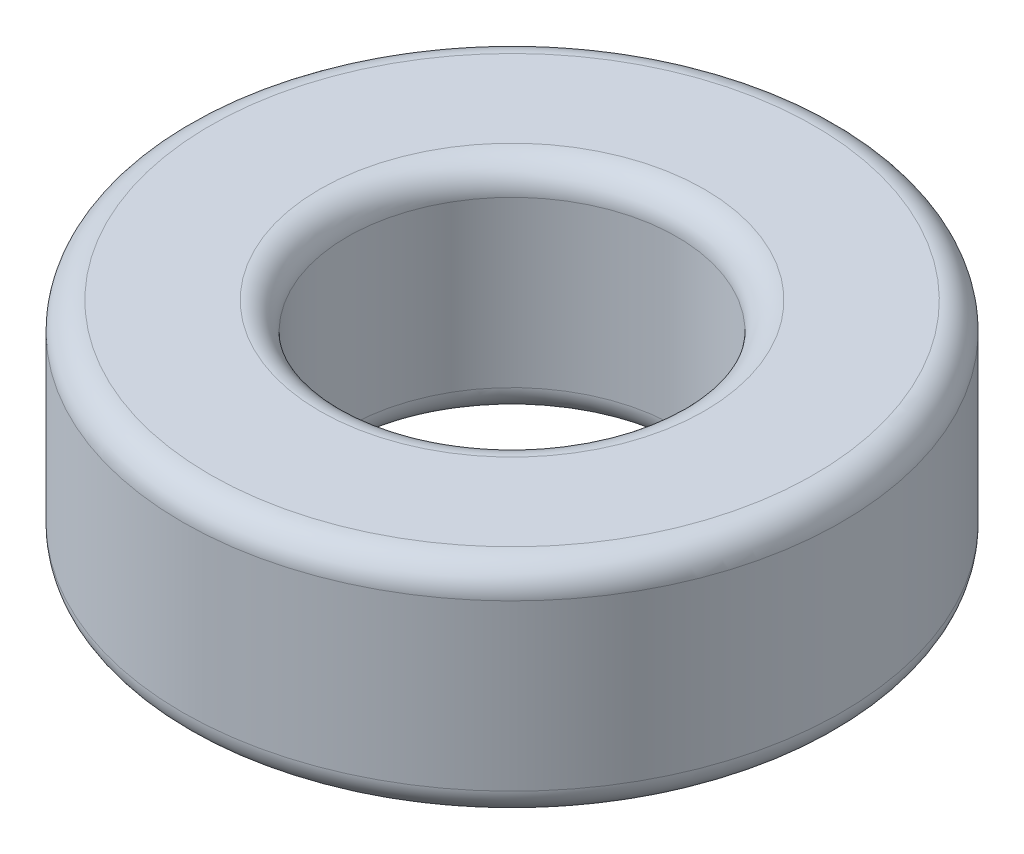
ISO-10303-21;
HEADER;
FILE_DESCRIPTION(('STEP AP214'),'2;1');
FILE_NAME('part.step','',(''),(''),'','','');
FILE_SCHEMA(('AUTOMOTIVE_DESIGN { 1 0 10303 214 1 1 1 1 }'));
ENDSEC;
DATA;
#1=APPLICATION_CONTEXT('core data for automotive mechanical design processes');
#2=APPLICATION_PROTOCOL_DEFINITION('international standard','automotive_design',2000,#1);
#3=PRODUCT_CONTEXT('',#1,'mechanical');
#4=PRODUCT('Part','Part','',(#3));
#5=PRODUCT_RELATED_PRODUCT_CATEGORY('part','',(#4));
#6=PRODUCT_DEFINITION_FORMATION('','',#4);
#7=PRODUCT_DEFINITION_CONTEXT('part definition',#1,'design');
#8=PRODUCT_DEFINITION('design','',#6,#7);
#9=PRODUCT_DEFINITION_SHAPE('','',#8);
#10=(LENGTH_UNIT() NAMED_UNIT(*) SI_UNIT(.MILLI.,.METRE.));
#11=(NAMED_UNIT(*) PLANE_ANGLE_UNIT() SI_UNIT($,.RADIAN.));
#12=(NAMED_UNIT(*) SI_UNIT($,.STERADIAN.) SOLID_ANGLE_UNIT());
#13=UNCERTAINTY_MEASURE_WITH_UNIT(LENGTH_MEASURE(1.E-05),#10,'distance_accuracy_value','');
#14=(GEOMETRIC_REPRESENTATION_CONTEXT(3) GLOBAL_UNCERTAINTY_ASSIGNED_CONTEXT((#13)) GLOBAL_UNIT_ASSIGNED_CONTEXT((#10,
#11,#12)) REPRESENTATION_CONTEXT('',''));
#15=CARTESIAN_POINT('',(0.,0.,0.));
#16=DIRECTION('',(0.,0.,1.));
#17=DIRECTION('',(1.,0.,0.));
#18=AXIS2_PLACEMENT_3D('',#15,#16,#17);
#19=CARTESIAN_POINT('',(0.,4.,0.));
#20=DIRECTION('',(0.,1.,0.));
#21=DIRECTION('',(0.,0.,1.));
#22=AXIS2_PLACEMENT_3D('',#19,#20,#21);
#23=PLANE('',#22);
#24=CARTESIAN_POINT('',(0.,4.,0.));
#25=DIRECTION('',(0.,1.,0.));
#26=DIRECTION('',(0.,0.,1.));
#27=AXIS2_PLACEMENT_3D('',#24,#25,#26);
#28=CIRCLE('',#27,5.5);
#29=CARTESIAN_POINT('',(0.,4.,5.5));
#30=VERTEX_POINT('',#29);
#31=EDGE_CURVE('E10',#30,#30,#28,.T.);
#32=ORIENTED_EDGE('',*,*,#31,.T.);
#33=EDGE_LOOP('',(#32));
#34=FACE_BOUND('',#33,.T.);
#35=CARTESIAN_POINT('',(0.,4.,0.));
#36=DIRECTION('',(0.,1.,0.));
#37=DIRECTION('',(0.,0.,1.));
#38=AXIS2_PLACEMENT_3D('',#35,#36,#37);
#39=CIRCLE('',#38,3.5);
#40=CARTESIAN_POINT('',(0.,4.,3.5));
#41=VERTEX_POINT('',#40);
#42=EDGE_CURVE('E41',#41,#41,#39,.F.);
#43=ORIENTED_EDGE('',*,*,#42,.T.);
#44=EDGE_LOOP('',(#43));
#45=FACE_BOUND('',#44,.T.);
#46=ADVANCED_FACE('F34',(#34,#45),#23,.T.);
#47=CARTESIAN_POINT('',(0.,0.,0.));
#48=DIRECTION('',(0.,1.,0.));
#49=DIRECTION('',(0.,0.,1.));
#50=AXIS2_PLACEMENT_3D('',#47,#48,#49);
#51=PLANE('',#50);
#52=CARTESIAN_POINT('',(0.,0.,0.));
#53=DIRECTION('',(0.,1.,0.));
#54=DIRECTION('',(0.,0.,1.));
#55=AXIS2_PLACEMENT_3D('',#52,#53,#54);
#56=CIRCLE('',#55,3.5);
#57=CARTESIAN_POINT('',(0.,0.,3.5));
#58=VERTEX_POINT('',#57);
#59=EDGE_CURVE('E60',#58,#58,#56,.T.);
#60=ORIENTED_EDGE('',*,*,#59,.T.);
#61=EDGE_LOOP('',(#60));
#62=FACE_BOUND('',#61,.T.);
#63=CARTESIAN_POINT('',(0.,0.,0.));
#64=DIRECTION('',(0.,1.,0.));
#65=DIRECTION('',(0.,0.,1.));
#66=AXIS2_PLACEMENT_3D('',#63,#64,#65);
#67=CIRCLE('',#66,5.5);
#68=CARTESIAN_POINT('',(0.,0.,5.5));
#69=VERTEX_POINT('',#68);
#70=EDGE_CURVE('E63',#69,#69,#67,.F.);
#71=ORIENTED_EDGE('',*,*,#70,.T.);
#72=EDGE_LOOP('',(#71));
#73=FACE_BOUND('',#72,.T.);
#74=ADVANCED_FACE('F67',(#62,#73),#51,.F.);
#75=CARTESIAN_POINT('',(0.,4.,0.));
#76=DIRECTION('',(0.,-1.,0.));
#77=DIRECTION('',(0.,0.,-1.));
#78=AXIS2_PLACEMENT_3D('',#75,#76,#77);
#79=CYLINDRICAL_SURFACE('',#78,6.);
#80=CARTESIAN_POINT('',(0.,0.5,0.));
#81=DIRECTION('',(0.,1.,0.));
#82=DIRECTION('',(0.,0.,1.));
#83=AXIS2_PLACEMENT_3D('',#80,#81,#82);
#84=CIRCLE('',#83,6.);
#85=CARTESIAN_POINT('',(0.,0.5,6.));
#86=VERTEX_POINT('',#85);
#87=EDGE_CURVE('E45',#86,#86,#84,.T.);
#88=ORIENTED_EDGE('',*,*,#87,.T.);
#89=EDGE_LOOP('',(#88));
#90=FACE_BOUND('',#89,.T.);
#91=CARTESIAN_POINT('',(0.,3.5,0.));
#92=DIRECTION('',(0.,1.,0.));
#93=DIRECTION('',(0.,0.,1.));
#94=AXIS2_PLACEMENT_3D('',#91,#92,#93);
#95=CIRCLE('',#94,6.);
#96=CARTESIAN_POINT('',(0.,3.5,6.));
#97=VERTEX_POINT('',#96);
#98=EDGE_CURVE('E49',#97,#97,#95,.F.);
#99=ORIENTED_EDGE('',*,*,#98,.T.);
#100=EDGE_LOOP('',(#99));
#101=FACE_BOUND('',#100,.T.);
#102=ADVANCED_FACE('F77',(#90,#101),#79,.T.);
#103=CARTESIAN_POINT('',(0.,4.,0.));
#104=DIRECTION('',(0.,-1.,0.));
#105=DIRECTION('',(0.,0.,-1.));
#106=AXIS2_PLACEMENT_3D('',#103,#104,#105);
#107=CYLINDRICAL_SURFACE('',#106,3.);
#108=CARTESIAN_POINT('',(0.,0.5,0.));
#109=DIRECTION('',(0.,1.,0.));
#110=DIRECTION('',(0.,0.,1.));
#111=AXIS2_PLACEMENT_3D('',#108,#109,#110);
#112=CIRCLE('',#111,3.);
#113=CARTESIAN_POINT('',(0.,0.5,3.));
#114=VERTEX_POINT('',#113);
#115=EDGE_CURVE('E54',#114,#114,#112,.F.);
#116=ORIENTED_EDGE('',*,*,#115,.T.);
#117=EDGE_LOOP('',(#116));
#118=FACE_BOUND('',#117,.T.);
#119=CARTESIAN_POINT('',(0.,3.5,0.));
#120=DIRECTION('',(0.,1.,0.));
#121=DIRECTION('',(0.,0.,1.));
#122=AXIS2_PLACEMENT_3D('',#119,#120,#121);
#123=CIRCLE('',#122,3.);
#124=CARTESIAN_POINT('',(0.,3.5,3.));
#125=VERTEX_POINT('',#124);
#126=EDGE_CURVE('E57',#125,#125,#123,.T.);
#127=ORIENTED_EDGE('',*,*,#126,.T.);
#128=EDGE_LOOP('',(#127));
#129=FACE_BOUND('',#128,.T.);
#130=ADVANCED_FACE('F80',(#118,#129),#107,.F.);
#131=CARTESIAN_POINT('',(0.,0.5,0.));
#132=DIRECTION('',(0.,1.,0.));
#133=DIRECTION('',(0.,0.,1.));
#134=AXIS2_PLACEMENT_3D('',#131,#132,#133);
#135=TOROIDAL_SURFACE('',#134,3.5,0.5);
#136=ORIENTED_EDGE('',*,*,#115,.F.);
#137=EDGE_LOOP('',(#136));
#138=FACE_BOUND('',#137,.T.);
#139=ORIENTED_EDGE('',*,*,#59,.F.);
#140=EDGE_LOOP('',(#139));
#141=FACE_BOUND('',#140,.T.);
#142=ADVANCED_FACE('F73',(#138,#141),#135,.T.);
#143=CARTESIAN_POINT('',(0.,0.5,0.));
#144=DIRECTION('',(0.,1.,0.));
#145=DIRECTION('',(0.,0.,1.));
#146=AXIS2_PLACEMENT_3D('',#143,#144,#145);
#147=TOROIDAL_SURFACE('',#146,5.5,0.5);
#148=ORIENTED_EDGE('',*,*,#70,.F.);
#149=EDGE_LOOP('',(#148));
#150=FACE_BOUND('',#149,.T.);
#151=ORIENTED_EDGE('',*,*,#87,.F.);
#152=EDGE_LOOP('',(#151));
#153=FACE_BOUND('',#152,.T.);
#154=ADVANCED_FACE('F69',(#150,#153),#147,.T.);
#155=CARTESIAN_POINT('',(0.,3.5,0.));
#156=DIRECTION('',(0.,1.,0.));
#157=DIRECTION('',(0.,0.,1.));
#158=AXIS2_PLACEMENT_3D('',#155,#156,#157);
#159=TOROIDAL_SURFACE('',#158,5.5,0.5);
#160=ORIENTED_EDGE('',*,*,#98,.F.);
#161=EDGE_LOOP('',(#160));
#162=FACE_BOUND('',#161,.T.);
#163=ORIENTED_EDGE('',*,*,#31,.F.);
#164=EDGE_LOOP('',(#163));
#165=FACE_BOUND('',#164,.T.);
#166=ADVANCED_FACE('F72',(#162,#165),#159,.T.);
#167=CARTESIAN_POINT('',(0.,3.5,0.));
#168=DIRECTION('',(0.,1.,0.));
#169=DIRECTION('',(0.,0.,1.));
#170=AXIS2_PLACEMENT_3D('',#167,#168,#169);
#171=TOROIDAL_SURFACE('',#170,3.5,0.5);
#172=ORIENTED_EDGE('',*,*,#42,.F.);
#173=EDGE_LOOP('',(#172));
#174=FACE_BOUND('',#173,.T.);
#175=ORIENTED_EDGE('',*,*,#126,.F.);
#176=EDGE_LOOP('',(#175));
#177=FACE_BOUND('',#176,.T.);
#178=ADVANCED_FACE('F36',(#174,#177),#171,.T.);
#179=CLOSED_SHELL('',(#46,#74,#102,#130,#142,#154,#166,#178));
#180=MANIFOLD_SOLID_BREP('B2',#179);
#181=ADVANCED_BREP_SHAPE_REPRESENTATION('',(#18,#180),#14);
#182=SHAPE_DEFINITION_REPRESENTATION(#9,#181);
ENDSEC;
END-ISO-10303-21;
